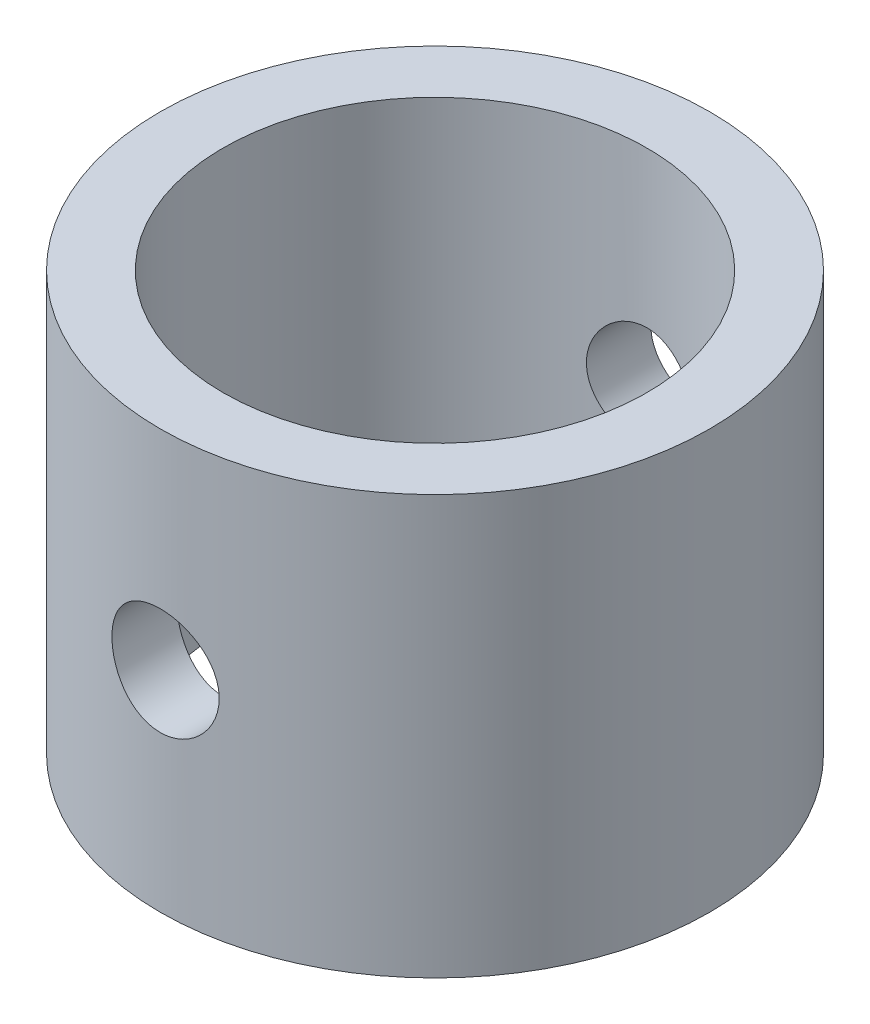
ISO-10303-21;
HEADER;
FILE_DESCRIPTION(('STEP AP214'),'2;1');
FILE_NAME('part.step','',(''),(''),'','','');
FILE_SCHEMA(('AUTOMOTIVE_DESIGN { 1 0 10303 214 1 1 1 1 }'));
ENDSEC;
DATA;
#1=APPLICATION_CONTEXT('core data for automotive mechanical design processes');
#2=APPLICATION_PROTOCOL_DEFINITION('international standard','automotive_design',2000,#1);
#3=PRODUCT_CONTEXT('',#1,'mechanical');
#4=PRODUCT('Part','Part','',(#3));
#5=PRODUCT_RELATED_PRODUCT_CATEGORY('part','',(#4));
#6=PRODUCT_DEFINITION_FORMATION('','',#4);
#7=PRODUCT_DEFINITION_CONTEXT('part definition',#1,'design');
#8=PRODUCT_DEFINITION('design','',#6,#7);
#9=PRODUCT_DEFINITION_SHAPE('','',#8);
#10=(LENGTH_UNIT() NAMED_UNIT(*) SI_UNIT(.MILLI.,.METRE.));
#11=(NAMED_UNIT(*) PLANE_ANGLE_UNIT() SI_UNIT($,.RADIAN.));
#12=(NAMED_UNIT(*) SI_UNIT($,.STERADIAN.) SOLID_ANGLE_UNIT());
#13=UNCERTAINTY_MEASURE_WITH_UNIT(LENGTH_MEASURE(1.E-05),#10,'distance_accuracy_value','');
#14=(GEOMETRIC_REPRESENTATION_CONTEXT(3) GLOBAL_UNCERTAINTY_ASSIGNED_CONTEXT((#13)) GLOBAL_UNIT_ASSIGNED_CONTEXT((#10,
#11,#12)) REPRESENTATION_CONTEXT('',''));
#15=CARTESIAN_POINT('',(0.,0.,0.));
#16=DIRECTION('',(0.,0.,1.));
#17=DIRECTION('',(1.,0.,0.));
#18=AXIS2_PLACEMENT_3D('',#15,#16,#17);
#19=CARTESIAN_POINT('',(0.,4.,0.));
#20=DIRECTION('',(0.,1.,0.));
#21=DIRECTION('',(0.,0.,1.));
#22=AXIS2_PLACEMENT_3D('',#19,#20,#21);
#23=PLANE('',#22);
#24=CARTESIAN_POINT('',(0.,4.,0.));
#25=DIRECTION('',(0.,1.,0.));
#26=DIRECTION('',(0.,0.,1.));
#27=AXIS2_PLACEMENT_3D('',#24,#25,#26);
#28=CIRCLE('',#27,5.25);
#29=CARTESIAN_POINT('',(0.,4.,5.25));
#30=VERTEX_POINT('',#29);
#31=EDGE_CURVE('E10',#30,#30,#28,.T.);
#32=ORIENTED_EDGE('',*,*,#31,.T.);
#33=EDGE_LOOP('',(#32));
#34=FACE_BOUND('',#33,.T.);
#35=CARTESIAN_POINT('',(0.,4.,0.));
#36=DIRECTION('',(0.,1.,0.));
#37=DIRECTION('',(0.,0.,1.));
#38=AXIS2_PLACEMENT_3D('',#35,#36,#37);
#39=CIRCLE('',#38,4.05);
#40=CARTESIAN_POINT('',(0.,4.,4.05));
#41=VERTEX_POINT('',#40);
#42=EDGE_CURVE('E58',#41,#41,#39,.T.);
#43=ORIENTED_EDGE('',*,*,#42,.F.);
#44=EDGE_LOOP('',(#43));
#45=FACE_BOUND('',#44,.T.);
#46=ADVANCED_FACE('F37',(#34,#45),#23,.T.);
#47=CARTESIAN_POINT('',(0.,-4.,0.));
#48=DIRECTION('',(0.,1.,0.));
#49=DIRECTION('',(0.,0.,1.));
#50=AXIS2_PLACEMENT_3D('',#47,#48,#49);
#51=PLANE('',#50);
#52=CARTESIAN_POINT('',(0.,-4.,0.));
#53=DIRECTION('',(0.,1.,0.));
#54=DIRECTION('',(0.,0.,1.));
#55=AXIS2_PLACEMENT_3D('',#52,#53,#54);
#56=CIRCLE('',#55,5.25);
#57=CARTESIAN_POINT('',(0.,-4.,5.25));
#58=VERTEX_POINT('',#57);
#59=EDGE_CURVE('E52',#58,#58,#56,.T.);
#60=ORIENTED_EDGE('',*,*,#59,.F.);
#61=EDGE_LOOP('',(#60));
#62=FACE_BOUND('',#61,.T.);
#63=CARTESIAN_POINT('',(0.,-4.,0.));
#64=DIRECTION('',(0.,1.,0.));
#65=DIRECTION('',(0.,0.,1.));
#66=AXIS2_PLACEMENT_3D('',#63,#64,#65);
#67=CIRCLE('',#66,4.05);
#68=CARTESIAN_POINT('',(0.,-4.,4.05));
#69=VERTEX_POINT('',#68);
#70=EDGE_CURVE('E61',#69,#69,#67,.T.);
#71=ORIENTED_EDGE('',*,*,#70,.T.);
#72=EDGE_LOOP('',(#71));
#73=FACE_BOUND('',#72,.T.);
#74=ADVANCED_FACE('F102',(#62,#73),#51,.F.);
#75=CARTESIAN_POINT('',(0.,4.,0.));
#76=DIRECTION('',(0.,-1.,0.));
#77=DIRECTION('',(0.,0.,-1.));
#78=AXIS2_PLACEMENT_3D('',#75,#76,#77);
#79=CYLINDRICAL_SURFACE('',#78,5.25);
#80=CARTESIAN_POINT('',(0.,1.025,-5.25));
#81=CARTESIAN_POINT('',(-0.0569945457445083,1.02499787076707,-5.24999895509399));
#82=CARTESIAN_POINT('',(-0.114016309744154,1.02023021303949,-5.24906234412122));
#83=CARTESIAN_POINT('',(-0.226449980456146,1.00129958196131,-5.24541633362499));
#84=CARTESIAN_POINT('',(-0.281860538943608,0.987128963879953,-5.24270549165283));
#85=CARTESIAN_POINT('',(-0.389429770584826,0.949845306555475,-5.23581393242335));
#86=CARTESIAN_POINT('',(-0.441591436686587,0.926740643361511,-5.23163459227995));
#87=CARTESIAN_POINT('',(-0.541293871018254,0.872269215363331,-5.2222611634429));
#88=CARTESIAN_POINT('',(-0.588834952320508,0.840903010863135,-5.21706714357177));
#89=CARTESIAN_POINT('',(-0.678565746116172,0.770368504787212,-5.20616152177096));
#90=CARTESIAN_POINT('',(-0.720687064000595,0.731114005463061,-5.20044461962103));
#91=CARTESIAN_POINT('',(-0.797790649071597,0.646102547934211,-5.18917642434921));
#92=CARTESIAN_POINT('',(-0.832772376425957,0.60034509847776,-5.18362514377722));
#93=CARTESIAN_POINT('',(-0.894892318163035,0.503137995598364,-5.17326506700958));
#94=CARTESIAN_POINT('',(-0.921960195821448,0.451642602026423,-5.16846309605212));
#95=CARTESIAN_POINT('',(-0.967033608858866,0.344725658286283,-5.16022038299082));
#96=CARTESIAN_POINT('',(-0.985039995071988,0.289304477289875,-5.15677951309208));
#97=CARTESIAN_POINT('',(-1.01125823397083,0.176843471759491,-5.1517021095214));
#98=CARTESIAN_POINT('',(-1.01958980815014,0.119832573054406,-5.15004354028286));
#99=CARTESIAN_POINT('',(-1.02659368667529,0.00519984525337541,-5.14865215948907));
#100=CARTESIAN_POINT('',(-1.02526693134544,-0.0524219238234783,-5.14891916046239));
#101=CARTESIAN_POINT('',(-1.01308871822038,-0.165768140802372,-5.15132871534479));
#102=CARTESIAN_POINT('',(-1.00237407326391,-0.221507946070025,-5.15344432762873));
#103=CARTESIAN_POINT('',(-0.971939992234642,-0.330383321134628,-5.15927034778042));
#104=CARTESIAN_POINT('',(-0.952220144444891,-0.383518771737736,-5.16298082856495));
#105=CARTESIAN_POINT('',(-0.904203571220753,-0.486073733364898,-5.17160629298606));
#106=CARTESIAN_POINT('',(-0.875852224753539,-0.535467002235353,-5.17652890805663));
#107=CARTESIAN_POINT('',(-0.811416018889909,-0.628846475379158,-5.18701903051379));
#108=CARTESIAN_POINT('',(-0.775330310939104,-0.672832085532075,-5.19258660862991));
#109=CARTESIAN_POINT('',(-0.695715220393614,-0.754937494209905,-5.20385631111491));
#110=CARTESIAN_POINT('',(-0.652068970919624,-0.792943968974009,-5.2095591070202));
#111=CARTESIAN_POINT('',(-0.558961160938746,-0.861113472511031,-5.22036927339696));
#112=CARTESIAN_POINT('',(-0.509499532430495,-0.89127640955333,-5.22547663690442));
#113=CARTESIAN_POINT('',(-0.406042097539188,-0.942921924638395,-5.23453213554434));
#114=CARTESIAN_POINT('',(-0.352039895342608,-0.964392001975985,-5.23847859903985));
#115=CARTESIAN_POINT('',(-0.241100996657606,-0.997923946704532,-5.24475486604935));
#116=CARTESIAN_POINT('',(-0.184164639431076,-1.0099868992046,-5.24708485601967));
#117=CARTESIAN_POINT('',(-0.0699479163571626,-1.02420278190998,-5.24983982017384));
#118=CARTESIAN_POINT('',(-0.0126875586734122,-1.02651086887603,-5.25029461749948));
#119=CARTESIAN_POINT('',(0.10140072658296,-1.02156871304283,-5.24933061266348));
#120=CARTESIAN_POINT('',(0.158228677107485,-1.01431898117681,-5.24791191065368));
#121=CARTESIAN_POINT('',(0.269341728844097,-0.990595923309088,-5.24337894093905));
#122=CARTESIAN_POINT('',(0.323644382161121,-0.974201780992348,-5.24027923575906));
#123=CARTESIAN_POINT('',(0.428730140629844,-0.932741473943547,-5.23273048343797));
#124=CARTESIAN_POINT('',(0.479512991162617,-0.907674682625204,-5.2282813388047));
#125=CARTESIAN_POINT('',(0.576774998290433,-0.849241969798817,-5.21845289136493));
#126=CARTESIAN_POINT('',(0.62319664642693,-0.815782094107525,-5.21306328414829));
#127=CARTESIAN_POINT('',(0.709821919698448,-0.741639333282223,-5.20197687439415));
#128=CARTESIAN_POINT('',(0.750024910936208,-0.700955712704254,-5.19628004061931));
#129=CARTESIAN_POINT('',(0.823666898128721,-0.612815483319799,-5.18512133278355));
#130=CARTESIAN_POINT('',(0.856999618591109,-0.565269399928531,-5.17966405052748));
#131=CARTESIAN_POINT('',(0.915205654374367,-0.465161806173781,-5.16969769178285));
#132=CARTESIAN_POINT('',(0.940079299416778,-0.412600491398471,-5.16518857833877));
#133=CARTESIAN_POINT('',(0.980513842280673,-0.304213345023198,-5.15766577330702));
#134=CARTESIAN_POINT('',(0.996121779404951,-0.248405609846543,-5.15464454174965));
#135=CARTESIAN_POINT('',(1.01772548966306,-0.134894764652072,-5.150423104147));
#136=CARTESIAN_POINT('',(1.02372245006497,-0.0771918896444936,-5.14922267317465));
#137=CARTESIAN_POINT('',(1.02589165997953,0.0374052261969555,-5.14879082551569));
#138=CARTESIAN_POINT('',(1.02223172467021,0.0942962305837578,-5.14952577580696));
#139=CARTESIAN_POINT('',(1.00556025615526,0.206635127872883,-5.15280695471401));
#140=CARTESIAN_POINT('',(0.992548790362195,0.262083031175134,-5.15535317027289));
#141=CARTESIAN_POINT('',(0.957616911353195,0.369861388031843,-5.16195528443157));
#142=CARTESIAN_POINT('',(0.93571614470436,0.422198426450321,-5.16600785213471));
#143=CARTESIAN_POINT('',(0.883646244771714,0.522481675948493,-5.1751681206033));
#144=CARTESIAN_POINT('',(0.853476460106566,0.570427540721958,-5.18027590448425));
#145=CARTESIAN_POINT('',(0.785147780603549,0.66140500994501,-5.19107457650358));
#146=CARTESIAN_POINT('',(0.746867325727988,0.704344370454146,-5.19677357367275));
#147=CARTESIAN_POINT('',(0.663655914440409,0.783245690363975,-5.20805339208247));
#148=CARTESIAN_POINT('',(0.618723432399547,0.819206044760107,-5.21363418587679));
#149=CARTESIAN_POINT('',(0.522950035242615,0.88346304383685,-5.22411374519241));
#150=CARTESIAN_POINT('',(0.472055084250298,0.911680383054292,-5.22900522015109));
#151=CARTESIAN_POINT('',(0.36616574286696,0.959117803267744,-5.23748348744656));
#152=CARTESIAN_POINT('',(0.311175161926133,0.978346126953237,-5.2410714743717));
#153=CARTESIAN_POINT('',(0.213371631984974,1.00346552524574,-5.24582803076861));
#154=CARTESIAN_POINT('',(0.17112143870484,1.0115267890344,-5.2473834885841));
#155=CARTESIAN_POINT('',(0.085919306347827,1.02229475067607,-5.24946985208106));
#156=CARTESIAN_POINT('',(0.0429673878404688,1.02500160519881,-5.25000078773997));
#157=CARTESIAN_POINT('',(0.,1.025,-5.25));
#158=B_SPLINE_CURVE_WITH_KNOTS('',3,(#80,#81,#82,#83,#84,#85,#86,#87,#88,#89,#90,#91,#92,#93,
#94,#95,#96,#97,#98,#99,#100,#101,#102,#103,#104,#105,#106,#107,#108,#109,#110,#111,#112,#113,
#114,#115,#116,#117,#118,#119,#120,#121,#122,#123,#124,#125,#126,#127,#128,#129,#130,#131,#132,
#133,#134,#135,#136,#137,#138,#139,#140,#141,#142,#143,#144,#145,#146,#147,#148,#149,#150,#151,
#152,#153,#154,#155,#156,#157),.UNSPECIFIED.,.T.,.F.,(4,2,2,2,2,2,2,2,2,2,2,2,2,2,2,2,2,2,2,2,2,
2,2,2,2,2,2,2,2,2,2,2,2,2,2,2,2,2,4),(0.,0.17082647043743,0.341791995493761,0.51259762018515,
0.683391663690558,0.856164843373737,1.02895108178957,1.20322932199825,1.37749119519349,
1.54957286808932,1.72163778752759,1.89123609173226,2.06084215073067,2.23154462595756,
2.40226583893651,2.57591001051018,2.74955621277095,2.92345124630528,3.09732621812993,
3.26842494972435,3.43951453524838,3.60914511226778,3.77878794740986,3.95042188980161,
4.12207331614392,4.29620816494117,4.47033622545597,4.64357255643614,4.81678748544759,
4.98701223476368,5.15723575698941,5.32708509298789,5.4969478124983,5.66956362142449,
5.84221908094102,6.01658197959449,6.19078467693962,6.31957212298941,6.44835580066985),.UNSPECIFIED.);
#159=CARTESIAN_POINT('',(0.,1.025,-5.25));
#160=VERTEX_POINT('',#159);
#161=EDGE_CURVE('E88',#160,#160,#158,.T.);
#162=ORIENTED_EDGE('',*,*,#161,.T.);
#163=EDGE_LOOP('',(#162));
#164=FACE_BOUND('',#163,.T.);
#165=CARTESIAN_POINT('',(1.025,0.,5.14896834327033));
#166=CARTESIAN_POINT('',(1.02499786167067,-0.056982875782178,5.14896946635616));
#167=CARTESIAN_POINT('',(1.02023209009959,-0.1139929945671,5.14992455549227));
#168=CARTESIAN_POINT('',(1.00130962965604,-0.226402484602599,5.15363643585038));
#169=CARTESIAN_POINT('',(0.987145251226546,-0.281800498121563,5.15639470233126));
#170=CARTESIAN_POINT('',(0.949879836299471,-0.389343163465167,5.16338891047388));
#171=CARTESIAN_POINT('',(0.926787469158744,-0.441490914529684,5.1676234182682));
#172=CARTESIAN_POINT('',(0.872345024996021,-0.541169895908444,5.17709128390533));
#173=CARTESIAN_POINT('',(0.840995479811591,-0.58870142327981,5.18232457741126));
#174=CARTESIAN_POINT('',(0.770478042320214,-0.678442432777861,5.19327917305722));
#175=CARTESIAN_POINT('',(0.731220211815927,-0.720580626823783,5.1990056101113));
#176=CARTESIAN_POINT('',(0.646194932002268,-0.797716946650631,5.21025601224456));
#177=CARTESIAN_POINT('',(0.600427038147126,-0.832714584434355,5.21577996346438));
#178=CARTESIAN_POINT('',(0.503210217915802,-0.894851629634125,5.22605823235575));
#179=CARTESIAN_POINT('',(0.451717347153054,-0.921923497452282,5.23080579118913));
#180=CARTESIAN_POINT('',(0.344805861903775,-0.967004975935666,5.23893875100675));
#181=CARTESIAN_POINT('',(0.2893875979816,-0.98501539468889,5.24232427345019));
#182=CARTESIAN_POINT('',(0.176937857565303,-1.01124137825389,5.24731543005418));
#183=CARTESIAN_POINT('',(0.11993542399104,-1.01957724499605,5.2489429072617));
#184=CARTESIAN_POINT('',(0.00531944374811333,-1.02659264487604,5.25030998131963));
#185=CARTESIAN_POINT('',(-0.0522940462033759,-1.02527306651708,5.25004975187861));
#186=CARTESIAN_POINT('',(-0.165670681930044,-1.01310667426416,5.24768771501975));
#187=CARTESIAN_POINT('',(-0.221448328770526,-1.0023894255088,5.24561095299549));
#188=CARTESIAN_POINT('',(-0.330398022290761,-0.971937195102272,5.23987738114283));
#189=CARTESIAN_POINT('',(-0.383569968155085,-0.952201864843091,5.23622051023315));
#190=CARTESIAN_POINT('',(-0.486170927494524,-0.904152329457103,5.22769610376166));
#191=CARTESIAN_POINT('',(-0.535575359997349,-0.87578696350441,5.22282138018724));
#192=CARTESIAN_POINT('',(-0.628971310527571,-0.811320339643468,5.21239931962318));
#193=CARTESIAN_POINT('',(-0.672962232855735,-0.775218231585164,5.20685190874455));
#194=CARTESIAN_POINT('',(-0.755050851606318,-0.695590901584991,5.19558911264627));
#195=CARTESIAN_POINT('',(-0.793038477404218,-0.651952301903761,5.18987246796497));
#196=CARTESIAN_POINT('',(-0.861173511964944,-0.55886671604539,5.17900320378633));
#197=CARTESIAN_POINT('',(-0.891320786028304,-0.509419630097993,5.17385059398014));
#198=CARTESIAN_POINT('',(-0.942954743039989,-0.405967334077441,5.16469056517657));
#199=CARTESIAN_POINT('',(-0.964424316183964,-0.351953370476207,5.1606854131005));
#200=CARTESIAN_POINT('',(-0.997951707251315,-0.240988737054512,5.1543075752517));
#201=CARTESIAN_POINT('',(-1.01001068917577,-0.184038431361059,5.15193468758761));
#202=CARTESIAN_POINT('',(-1.02421155741571,-0.0698133762566427,5.14913029837767));
#203=CARTESIAN_POINT('',(-1.02651207893208,-0.0125590900525433,5.1486677454073));
#204=CARTESIAN_POINT('',(-1.02155696177758,0.10151528444376,5.14965314757069));
#205=CARTESIAN_POINT('',(-1.01430183793514,0.15833539596206,5.15110099977778));
#206=CARTESIAN_POINT('',(-0.990577915165318,0.269399839023168,5.15571505711595));
#207=CARTESIAN_POINT('',(-0.974193255902491,0.323662854421067,5.15886556238498));
#208=CARTESIAN_POINT('',(-0.932765060229681,0.428673493655867,5.16651626998133));
#209=CARTESIAN_POINT('',(-0.907720839363794,0.479420839231835,5.17101657899405));
#210=CARTESIAN_POINT('',(-0.849323007248364,0.576655585904167,5.18092995169431));
#211=CARTESIAN_POINT('',(-0.81586976532508,0.623082041112868,5.18635368793989));
#212=CARTESIAN_POINT('',(-0.74173690880497,0.709720063035419,5.1974732294045));
#213=CARTESIAN_POINT('',(-0.701056587081983,0.749931020879724,5.20316906120654));
#214=CARTESIAN_POINT('',(-0.612913597631636,0.823594647217124,5.21429140931118));
#215=CARTESIAN_POINT('',(-0.565360722750108,0.856940276978316,5.21971279066629));
#216=CARTESIAN_POINT('',(-0.465235675091349,0.915168936584965,5.22958723689548));
#217=CARTESIAN_POINT('',(-0.412663706657897,0.940052310768617,5.23404034116712));
#218=CARTESIAN_POINT('',(-0.304279744229791,0.980492454777878,5.2414545020078));
#219=CARTESIAN_POINT('',(-0.248487439075401,0.996100427467877,5.24442373521909));
#220=CARTESIAN_POINT('',(-0.135009493557086,1.01770942027248,5.24857059926565));
#221=CARTESIAN_POINT('',(-0.0773240707757307,1.02371154050216,5.24974843526083));
#222=CARTESIAN_POINT('',(0.0372786523514441,1.02589751184744,5.25017524303441));
#223=CARTESIAN_POINT('',(0.0941928217651152,1.02224257455305,5.24945588626434));
#224=CARTESIAN_POINT('',(0.206579382646085,1.00557301890115,5.24623542403847));
#225=CARTESIAN_POINT('',(0.262051790513596,0.992558507058271,5.24373433885923));
#226=CARTESIAN_POINT('',(0.369885623672705,0.95760946421613,5.23723198614737));
#227=CARTESIAN_POINT('',(0.422253249661485,0.935693449239575,5.23323383400505));
#228=CARTESIAN_POINT('',(0.522591434318303,0.88358347395156,5.22416873664343));
#229=CARTESIAN_POINT('',(0.570561665357181,0.853388897511311,5.21910171188017));
#230=CARTESIAN_POINT('',(0.661542912292849,0.785030788858347,5.20835813665762));
#231=CARTESIAN_POINT('',(0.704465979941935,0.746751477350745,5.20267338713658));
#232=CARTESIAN_POINT('',(0.783334958264116,0.663549330418454,5.19138493337764));
#233=CARTESIAN_POINT('',(0.819279219157952,0.618624928515997,5.18578124859238));
#234=CARTESIAN_POINT('',(0.883516218354135,0.522860090722791,5.17522680423202));
#235=CARTESIAN_POINT('',(0.911727395874809,0.471964119063962,5.17028326697057));
#236=CARTESIAN_POINT('',(0.959153024889174,0.366073147577132,5.16169652717926));
#237=CARTESIAN_POINT('',(0.978375766711373,0.311081979379822,5.15805212715297));
#238=CARTESIAN_POINT('',(1.00348153868778,0.213292803441145,5.15321640854314));
#239=CARTESIAN_POINT('',(1.01153676135071,0.171058434984084,5.15163309585073));
#240=CARTESIAN_POINT('',(1.02229671356983,0.0858878557086749,5.14950865637033));
#241=CARTESIAN_POINT('',(1.02500161179667,0.0429516670584549,5.14896749672813));
#242=CARTESIAN_POINT('',(1.025,0.,5.14896834327033));
#243=B_SPLINE_CURVE_WITH_KNOTS('',3,(#165,#166,#167,#168,#169,#170,#171,#172,#173,#174,#175,
#176,#177,#178,#179,#180,#181,#182,#183,#184,#185,#186,#187,#188,#189,#190,#191,#192,#193,#194,
#195,#196,#197,#198,#199,#200,#201,#202,#203,#204,#205,#206,#207,#208,#209,#210,#211,#212,#213,
#214,#215,#216,#217,#218,#219,#220,#221,#222,#223,#224,#225,#226,#227,#228,#229,#230,#231,#232,
#233,#234,#235,#236,#237,#238,#239,#240,#241,#242),.UNSPECIFIED.,.T.,.F.,(4,2,2,2,2,2,2,2,2,2,2,
2,2,2,2,2,2,2,2,2,2,2,2,2,2,2,2,2,2,2,2,2,2,2,2,2,2,2,4),(0.,0.170791394165799,
0.341722695469236,0.512488432313312,0.683243172975148,0.856062258255832,1.02889315032001,
1.20315659925475,1.37740450485065,1.54946162277745,1.72150290804438,1.8912089173805,
2.06092148752235,2.23166043198953,2.40241814769372,2.57601324940425,2.74961133333087,
2.92355004980736,3.09746724829907,3.26854611776921,3.43961577041948,3.60913428281098,
3.77866619709107,3.95031012221495,4.12197085092031,4.29613341841515,4.47028889820139,
4.64347383770609,4.81663894169881,4.98693162442672,5.15722236920629,5.32716069151863,
5.49711166486077,5.66968515512388,5.84229939195677,6.01666967405474,6.19087880994608,
6.31961935298717,6.44835583737768),.UNSPECIFIED.);
#244=CARTESIAN_POINT('',(1.025,0.,5.14896834327033));
#245=VERTEX_POINT('',#244);
#246=EDGE_CURVE('E82',#245,#245,#243,.T.);
#247=ORIENTED_EDGE('',*,*,#246,.T.);
#248=EDGE_LOOP('',(#247));
#249=FACE_BOUND('',#248,.T.);
#250=ORIENTED_EDGE('',*,*,#31,.F.);
#251=EDGE_LOOP('',(#250));
#252=FACE_BOUND('',#251,.T.);
#253=ORIENTED_EDGE('',*,*,#59,.T.);
#254=EDGE_LOOP('',(#253));
#255=FACE_BOUND('',#254,.T.);
#256=ADVANCED_FACE('F39',(#164,#249,#252,#255),#79,.T.);
#257=CARTESIAN_POINT('',(0.,4.,0.));
#258=DIRECTION('',(0.,-1.,0.));
#259=DIRECTION('',(0.,0.,-1.));
#260=AXIS2_PLACEMENT_3D('',#257,#258,#259);
#261=CYLINDRICAL_SURFACE('',#260,4.05);
#262=CARTESIAN_POINT('',(0.,1.025,-4.05));
#263=CARTESIAN_POINT('',(-0.0566091205131266,1.02499845315648,-4.049999058668));
#264=CARTESIAN_POINT('',(-0.11323538657555,1.02029458551346,-4.04880131498839));
#265=CARTESIAN_POINT('',(-0.224863499208174,1.00163250191266,-4.04413938355023));
#266=CARTESIAN_POINT('',(-0.279864432813969,0.98766918430307,-4.04067394638119));
#267=CARTESIAN_POINT('',(-0.386613878700822,0.950966074067556,-4.03186014523598));
#268=CARTESIAN_POINT('',(-0.438366260326949,0.928236962214368,-4.02651407343238));
#269=CARTESIAN_POINT('',(-0.537323723540563,0.874685403136447,-4.01450756910864));
#270=CARTESIAN_POINT('',(-0.584528624119948,0.843862633933269,-4.0078470843017));
#271=CARTESIAN_POINT('',(-0.674045608685482,0.774312888837497,-3.99377723319062));
#272=CARTESIAN_POINT('',(-0.716248246046299,0.735447422308569,-3.98635608400671));
#273=CARTESIAN_POINT('',(-0.793611274044625,0.651211955372253,-3.97167911516037));
#274=CARTESIAN_POINT('',(-0.828770850136255,0.6058412036539,-3.96442331470677));
#275=CARTESIAN_POINT('',(-0.891567847742758,0.509028968527848,-3.95077946904372));
#276=CARTESIAN_POINT('',(-0.919082210453253,0.457505365779316,-3.94440636596357));
#277=CARTESIAN_POINT('',(-0.965016151362072,0.350376657462895,-3.93342159402785));
#278=CARTESIAN_POINT('',(-0.98343722338389,0.294772224009001,-3.92880963588392));
#279=CARTESIAN_POINT('',(-1.01028708682748,0.182265316160142,-3.92199053852064));
#280=CARTESIAN_POINT('',(-1.01891296653997,0.125412814717365,-3.91973604156871));
#281=CARTESIAN_POINT('',(-1.02654158953911,0.0110264002934129,-3.91774542099473));
#282=CARTESIAN_POINT('',(-1.02554593988955,-0.0465073972889603,-3.91800887680424));
#283=CARTESIAN_POINT('',(-1.01411687387429,-0.159107733572223,-3.92098185810357));
#284=CARTESIAN_POINT('',(-1.00391896032766,-0.214200040299565,-3.92363034289209));
#285=CARTESIAN_POINT('',(-0.974750799157492,-0.32186523837555,-3.93097760334603));
#286=CARTESIAN_POINT('',(-0.955779912773148,-0.374437945964331,-3.93567652830274));
#287=CARTESIAN_POINT('',(-0.909405224473957,-0.476199899132308,-3.94665081843679));
#288=CARTESIAN_POINT('',(-0.881916480391581,-0.525348664422375,-3.95294194005765));
#289=CARTESIAN_POINT('',(-0.81934576019769,-0.618420013748902,-3.96638295470381));
#290=CARTESIAN_POINT('',(-0.784262425067588,-0.662341660232622,-3.97353300132791));
#291=CARTESIAN_POINT('',(-0.706281373805658,-0.745060852394969,-3.98814271976572));
#292=CARTESIAN_POINT('',(-0.663185096030641,-0.783670931085034,-3.99560533067275));
#293=CARTESIAN_POINT('',(-0.571039623664827,-0.853152010254237,-4.00981091969453));
#294=CARTESIAN_POINT('',(-0.521990238307623,-0.884022762630638,-4.016553874735));
#295=CARTESIAN_POINT('',(-0.419059282976756,-0.937220174279585,-4.02859533505547));
#296=CARTESIAN_POINT('',(-0.365160994465369,-0.959515756232338,-4.03388856680784));
#297=CARTESIAN_POINT('',(-0.25421744102225,-0.99467726245037,-4.04239587320389));
#298=CARTESIAN_POINT('',(-0.197172795831502,-1.00754503663847,-4.04561035572487));
#299=CARTESIAN_POINT('',(-0.0831580971566292,-1.02319790616084,-4.04953738001926));
#300=CARTESIAN_POINT('',(-0.026225210735174,-1.02623821731955,-4.05031323697134));
#301=CARTESIAN_POINT('',(0.0873360661548058,-1.02285071766051,-4.04945623280305));
#302=CARTESIAN_POINT('',(0.143964484275187,-1.01642378175211,-4.04782359426217));
#303=CARTESIAN_POINT('',(0.254418146356898,-0.994494415517036,-4.04237367843196));
#304=CARTESIAN_POINT('',(0.308272957398979,-0.979131780572245,-4.03859007233615));
#305=CARTESIAN_POINT('',(0.412637846494943,-0.939927263077812,-4.02926513297239));
#306=CARTESIAN_POINT('',(0.463147581353996,-0.916084512087302,-4.02372361968508));
#307=CARTESIAN_POINT('',(0.560399666701956,-0.860105807088282,-4.01134650397574));
#308=CARTESIAN_POINT('',(0.607057348962896,-0.827827648758346,-4.00448930746623));
#309=CARTESIAN_POINT('',(0.694384342690385,-0.756075607002226,-3.99027457428463));
#310=CARTESIAN_POINT('',(0.735052591326016,-0.716600449236015,-3.98291694914879));
#311=CARTESIAN_POINT('',(0.810302352396297,-0.630388818822973,-3.96830177235484));
#312=CARTESIAN_POINT('',(0.844704637047227,-0.583494418935527,-3.96105141586454));
#313=CARTESIAN_POINT('',(0.905152114204653,-0.484448159181289,-3.94767802391568));
#314=CARTESIAN_POINT('',(0.931197675241879,-0.432296531291093,-3.94155493874963));
#315=CARTESIAN_POINT('',(0.973997648626582,-0.324493339949352,-3.93119748694538));
#316=CARTESIAN_POINT('',(0.990807037777042,-0.268864730583448,-3.92695197455288));
#317=CARTESIAN_POINT('',(1.01480004690139,-0.155446738318638,-3.92082097293563));
#318=CARTESIAN_POINT('',(1.02198583471691,-0.0976578450677852,-3.91893495221093));
#319=CARTESIAN_POINT('',(1.02641228422198,0.0166145203964342,-3.91777770036457));
#320=CARTESIAN_POINT('',(1.02393968501677,0.0730862975439953,-3.91843107646042));
#321=CARTESIAN_POINT('',(1.00977740389941,0.18477956343833,-3.92210428878897));
#322=CARTESIAN_POINT('',(0.998087916212027,0.240001078506281,-3.925124075155));
#323=CARTESIAN_POINT('',(0.965982072555603,0.347305647656783,-3.93314730774656));
#324=CARTESIAN_POINT('',(0.945620760081232,0.399406172154354,-3.93813822812566));
#325=CARTESIAN_POINT('',(0.896792614156551,0.499489238192873,-3.94954286080208));
#326=CARTESIAN_POINT('',(0.868324629016477,0.547471193360084,-3.95595677523111));
#327=CARTESIAN_POINT('',(0.80319771449916,0.639337658232108,-3.96969863363425));
#328=CARTESIAN_POINT('',(0.766340414717692,0.683078593494926,-3.97704640693163));
#329=CARTESIAN_POINT('',(0.685866008688662,0.763847978273869,-3.99171111870157));
#330=CARTESIAN_POINT('',(0.642247293253314,0.800874825302367,-3.9990280494068));
#331=CARTESIAN_POINT('',(0.54850439582559,0.86784071236521,-4.01296989622006));
#332=CARTESIAN_POINT('',(0.498273872077945,0.897634362323226,-4.01957932437565));
#333=CARTESIAN_POINT('',(0.393353863158159,0.948307128521453,-4.03119703549237));
#334=CARTESIAN_POINT('',(0.338667545951823,0.96919251358754,-4.03620644377628));
#335=CARTESIAN_POINT('',(0.236747654142651,0.998423114959853,-4.04333574065164));
#336=CARTESIAN_POINT('',(0.189991611707854,1.0083676200443,-4.04581748539022));
#337=CARTESIAN_POINT('',(0.095494394242803,1.02165645382028,-4.04914994755959));
#338=CARTESIAN_POINT('',(0.0477532974794289,1.02500130485827,-4.05000079407182));
#339=CARTESIAN_POINT('',(0.,1.025,-4.05));
#340=B_SPLINE_CURVE_WITH_KNOTS('',3,(#262,#263,#264,#265,#266,#267,#268,#269,#270,#271,#272,
#273,#274,#275,#276,#277,#278,#279,#280,#281,#282,#283,#284,#285,#286,#287,#288,#289,#290,#291,
#292,#293,#294,#295,#296,#297,#298,#299,#300,#301,#302,#303,#304,#305,#306,#307,#308,#309,#310,
#311,#312,#313,#314,#315,#316,#317,#318,#319,#320,#321,#322,#323,#324,#325,#326,#327,#328,#329,
#330,#331,#332,#333,#334,#335,#336,#337,#338,#339),.UNSPECIFIED.,.T.,.F.,(4,2,2,2,2,2,2,2,2,2,2,
2,2,2,2,2,2,2,2,2,2,2,2,2,2,2,2,2,2,2,2,2,2,2,2,2,2,2,4),(0.,0.169652340797023,
0.339398232192964,0.508937945089829,0.678484403565722,0.851238091257644,1.02401174678176,
1.19942360062491,1.37480662864116,1.54659453254118,1.71835374356507,1.88583823011599,
2.05333491314519,2.22255880647852,2.39181300675079,2.56601809755531,2.74022877220952,
2.91506498561358,3.08986688349143,3.26009115294402,3.43029969222061,3.59791439761536,
3.76554627322239,3.93621022084299,4.10690441655436,4.28190044306123,4.45688875119863,
4.63082386382724,4.80471978871081,4.97349288256539,5.14226242000953,5.30997631194617,
5.47771404237071,5.64992953375932,5.8221860747998,5.99766178335797,6.17301380353817,
6.3161373834812,6.45924963508884),.UNSPECIFIED.);
#341=CARTESIAN_POINT('',(0.,1.025,-4.05));
#342=VERTEX_POINT('',#341);
#343=EDGE_CURVE('E42',#342,#342,#340,.T.);
#344=ORIENTED_EDGE('',*,*,#343,.F.);
#345=EDGE_LOOP('',(#344));
#346=FACE_BOUND('',#345,.T.);
#347=CARTESIAN_POINT('',(1.025,0.,3.91814688341313));
#348=CARTESIAN_POINT('',(1.02499843419359,-0.0565763775107299,3.91814794924588));
#349=CARTESIAN_POINT('',(1.02029981958999,-0.113169940152112,3.91938567691443));
#350=CARTESIAN_POINT('',(1.00166048910218,-0.224730213362142,3.92418981753014));
#351=CARTESIAN_POINT('',(0.987714529610029,-0.279695982424059,3.9277575516652));
#352=CARTESIAN_POINT('',(0.951062143270867,-0.3863708445405,3.93679234138341));
#353=CARTESIAN_POINT('',(0.928367206829757,-0.438084106067791,3.94225690484593));
#354=CARTESIAN_POINT('',(0.874896274811971,-0.536975284892839,3.95446651793905));
#355=CARTESIAN_POINT('',(0.844119883980861,-0.584152980207164,3.96121163019532));
#356=CARTESIAN_POINT('',(0.774618293132581,-0.67369756962982,3.97539262421482));
#357=CARTESIAN_POINT('',(0.735744159532017,-0.71594710647729,3.98283976489306));
#358=CARTESIAN_POINT('',(0.651471280866511,-0.793401535154336,3.99748813075451));
#359=CARTESIAN_POINT('',(0.606071914874506,-0.828605755803222,4.00468933245391));
#360=CARTESIAN_POINT('',(0.509231538647019,-0.891452049378779,4.01815920038164));
#361=CARTESIAN_POINT('',(0.457713304910624,-0.918978582814156,4.02441303195713));
#362=CARTESIAN_POINT('',(0.350596088956521,-0.964936469464546,4.0351549419405));
#363=CARTESIAN_POINT('',(0.294997725728796,-0.983369199022865,4.03964328753307));
#364=CARTESIAN_POINT('',(0.182522218068056,-1.01023963231755,4.0462689145541));
#365=CARTESIAN_POINT('',(0.125695505657138,-1.01887669018442,4.04845302313965));
#366=CARTESIAN_POINT('',(0.0113605379236298,-1.02653662776192,4.05038736555516));
#367=CARTESIAN_POINT('',(-0.046147612915295,-1.02556096279911,4.05013796780798));
#368=CARTESIAN_POINT('',(-0.158829483722516,-1.01416598912885,4.04726815690069));
#369=CARTESIAN_POINT('',(-0.214026551734847,-1.00396190002808,4.04470178121615));
#370=CARTESIAN_POINT('',(-0.321897959330875,-0.974745991123739,4.03754944718563));
#371=CARTESIAN_POINT('',(-0.374572162611812,-0.955733696030345,4.03296337985796));
#372=CARTESIAN_POINT('',(-0.476466438670354,-0.909268601958135,4.02220474798546));
#373=CARTESIAN_POINT('',(-0.525650258213079,-0.881739728653167,4.01601797009576));
#374=CARTESIAN_POINT('',(-0.618775229361741,-0.819080750943909,4.00272821026837));
#375=CARTESIAN_POINT('',(-0.662715446534986,-0.783949294855311,3.99562506549808));
#376=CARTESIAN_POINT('',(-0.745389672219053,-0.70593068749183,3.98104350215054));
#377=CARTESIAN_POINT('',(-0.783945581398339,-0.662855528379277,3.97356013907607));
#378=CARTESIAN_POINT('',(-0.853326982014105,-0.570772678619214,3.95924129259787));
#379=CARTESIAN_POINT('',(-0.884152093453551,-0.521764696527201,3.95240584105164));
#380=CARTESIAN_POINT('',(-0.937314755979843,-0.41885137444297,3.94013865180434));
#381=CARTESIAN_POINT('',(-0.959608437902923,-0.364922442153164,3.93471421414884));
#382=CARTESIAN_POINT('',(-0.994757096696777,-0.253911427253809,3.92597630040968));
#383=CARTESIAN_POINT('',(-1.00761415049604,-0.196830041450322,3.92266235984328));
#384=CARTESIAN_POINT('',(-1.02322701950195,-0.0827886466345704,3.91861841315089));
#385=CARTESIAN_POINT('',(-1.02624658822413,-0.0258670965477588,3.91782095621771));
#386=CARTESIAN_POINT('',(-1.02282168642549,0.0876668209591644,3.91871649481023));
#387=CARTESIAN_POINT('',(-1.01637811126661,0.144279217121421,3.92040925472236));
#388=CARTESIAN_POINT('',(-0.994441326143067,0.254601800960929,3.92602976699662));
#389=CARTESIAN_POINT('',(-0.979102574777992,0.30834483262518,3.92991934380894));
#390=CARTESIAN_POINT('',(-0.939982537806535,0.412496572187516,3.9394587976946));
#391=CARTESIAN_POINT('',(-0.916200233098804,0.462904876726437,3.94510888724434));
#392=CARTESIAN_POINT('',(-0.860319138472213,0.560071255367632,3.95767411136841));
#393=CARTESIAN_POINT('',(-0.828063164834317,0.606735879058482,3.96461233856714));
#394=CARTESIAN_POINT('',(-0.75634839888165,0.694086936355717,3.97891584458195));
#395=CARTESIAN_POINT('',(-0.716888392152619,0.734772359932733,3.98628119525697));
#396=CARTESIAN_POINT('',(-0.630673500547105,0.810083301070801,4.00083830966729));
#397=CARTESIAN_POINT('',(-0.583757127004294,0.844526093362475,4.00802073979712));
#398=CARTESIAN_POINT('',(-0.484653760084952,0.905044761569508,4.02120700497719));
#399=CARTESIAN_POINT('',(-0.432467043462351,0.931121076521585,4.02721090186535));
#400=CARTESIAN_POINT('',(-0.324666990952974,0.973937518142508,4.037325554559));
#401=CARTESIAN_POINT('',(-0.269081898368591,0.990745365568268,4.04145000311245));
#402=CARTESIAN_POINT('',(-0.155757614274405,1.01474993213069,4.04740105190799));
#403=CARTESIAN_POINT('',(-0.098018851852327,1.02194855536391,4.04922810738124));
#404=CARTESIAN_POINT('',(0.0162589195673378,1.02642100334922,4.05035940079832));
#405=CARTESIAN_POINT('',(0.0727868665786524,1.02396418718274,4.04973211016026));
#406=CARTESIAN_POINT('',(0.1845967849584,1.00981398556215,4.04617757658972));
#407=CARTESIAN_POINT('',(0.239878795023873,0.998120887381631,4.04325040518981));
#408=CARTESIAN_POINT('',(0.347338014459558,0.965975981281765,4.03543615134828));
#409=CARTESIAN_POINT('',(0.399530981177162,0.945573961530921,4.03056021974863));
#410=CARTESIAN_POINT('',(0.499782557971605,0.896635353009186,4.01936121836333));
#411=CARTESIAN_POINT('',(0.547840634630212,0.868097716751665,4.0130379622507));
#412=CARTESIAN_POINT('',(0.639731300402854,0.802882460222965,3.99943196130235));
#413=CARTESIAN_POINT('',(0.683431799814703,0.766022828708366,3.99212953234919));
#414=CARTESIAN_POINT('',(0.764118579205178,0.68556178837276,3.97747509411511));
#415=CARTESIAN_POINT('',(0.801103143309031,0.641958661889968,3.97012307265987));
#416=CARTESIAN_POINT('',(0.868008120287769,0.548238292370713,3.95604044638414));
#417=CARTESIAN_POINT('',(0.897778880539535,0.498011831570017,3.94932452423419));
#418=CARTESIAN_POINT('',(0.948409885493606,0.393103787319703,3.93747375206165));
#419=CARTESIAN_POINT('',(0.969276496997916,0.338425420576733,3.93233777305604));
#420=CARTESIAN_POINT('',(0.998467516351051,0.236551245542002,3.92501507454112));
#421=CARTESIAN_POINT('',(1.00839521365318,0.189835011582093,3.9224591429799));
#422=CARTESIAN_POINT('',(1.02166181909343,0.0954165333258665,3.91902467349762));
#423=CARTESIAN_POINT('',(1.02500132054193,0.0477143782092329,3.91814598453007));
#424=CARTESIAN_POINT('',(1.025,0.,3.91814688341313));
#425=B_SPLINE_CURVE_WITH_KNOTS('',3,(#347,#348,#349,#350,#351,#352,#353,#354,#355,#356,#357,
#358,#359,#360,#361,#362,#363,#364,#365,#366,#367,#368,#369,#370,#371,#372,#373,#374,#375,#376,
#377,#378,#379,#380,#381,#382,#383,#384,#385,#386,#387,#388,#389,#390,#391,#392,#393,#394,#395,
#396,#397,#398,#399,#400,#401,#402,#403,#404,#405,#406,#407,#408,#409,#410,#411,#412,#413,#414,
#415,#416,#417,#418,#419,#420,#421,#422,#423,#424),.UNSPECIFIED.,.T.,.F.,(4,2,2,2,2,2,2,2,2,2,2,
2,2,2,2,2,2,2,2,2,2,2,2,2,2,2,2,2,2,2,2,2,2,2,2,2,2,2,4),(0.,0.169553869588619,
0.339203965196116,0.508632006995049,0.678068336864289,0.850950684855348,1.0238494948634,
1.19922483060162,1.37457361520911,1.54628593028114,1.71797224921724,1.8857550251992,
2.05354685577597,2.22288301184678,2.39224929943444,2.56631085565147,2.7403809659556,
2.91533449937612,3.09024951532796,3.26043452040081,3.43060342433813,3.59790236040971,
3.765221495627,3.9358953507925,4.10659800378094,4.28169008898877,4.45677298461431,
4.63055907542553,4.80431072488784,4.97325008119429,5.14218418323215,5.31016517214789,
5.4781677989284,5.65027929820015,5.82243470908215,5.99790335345346,6.17324632002956,
6.31625452393311,6.45924984841913),.UNSPECIFIED.);
#426=CARTESIAN_POINT('',(1.025,0.,3.91814688341313));
#427=VERTEX_POINT('',#426);
#428=EDGE_CURVE('E63',#427,#427,#425,.T.);
#429=ORIENTED_EDGE('',*,*,#428,.F.);
#430=EDGE_LOOP('',(#429));
#431=FACE_BOUND('',#430,.T.);
#432=ORIENTED_EDGE('',*,*,#42,.T.);
#433=EDGE_LOOP('',(#432));
#434=FACE_BOUND('',#433,.T.);
#435=ORIENTED_EDGE('',*,*,#70,.F.);
#436=EDGE_LOOP('',(#435));
#437=FACE_BOUND('',#436,.T.);
#438=ADVANCED_FACE('F69',(#346,#431,#434,#437),#261,.F.);
#439=CARTESIAN_POINT('',(0.,0.,-5.25));
#440=DIRECTION('',(0.,0.,1.));
#441=DIRECTION('',(1.,0.,0.));
#442=AXIS2_PLACEMENT_3D('',#439,#440,#441);
#443=CYLINDRICAL_SURFACE('',#442,1.025);
#444=ORIENTED_EDGE('',*,*,#428,.T.);
#445=EDGE_LOOP('',(#444));
#446=FACE_BOUND('',#445,.T.);
#447=ORIENTED_EDGE('',*,*,#246,.F.);
#448=EDGE_LOOP('',(#447));
#449=FACE_BOUND('',#448,.T.);
#450=ADVANCED_FACE('F75',(#446,#449),#443,.F.);
#451=ORIENTED_EDGE('',*,*,#343,.T.);
#452=EDGE_LOOP('',(#451));
#453=FACE_BOUND('',#452,.T.);
#454=ORIENTED_EDGE('',*,*,#161,.F.);
#455=EDGE_LOOP('',(#454));
#456=FACE_BOUND('',#455,.T.);
#457=ADVANCED_FACE('F72',(#453,#456),#443,.F.);
#458=CLOSED_SHELL('',(#46,#74,#256,#438,#450,#457));
#459=MANIFOLD_SOLID_BREP('B2',#458);
#460=ADVANCED_BREP_SHAPE_REPRESENTATION('',(#18,#459),#14);
#461=SHAPE_DEFINITION_REPRESENTATION(#9,#460);
ENDSEC;
END-ISO-10303-21;
